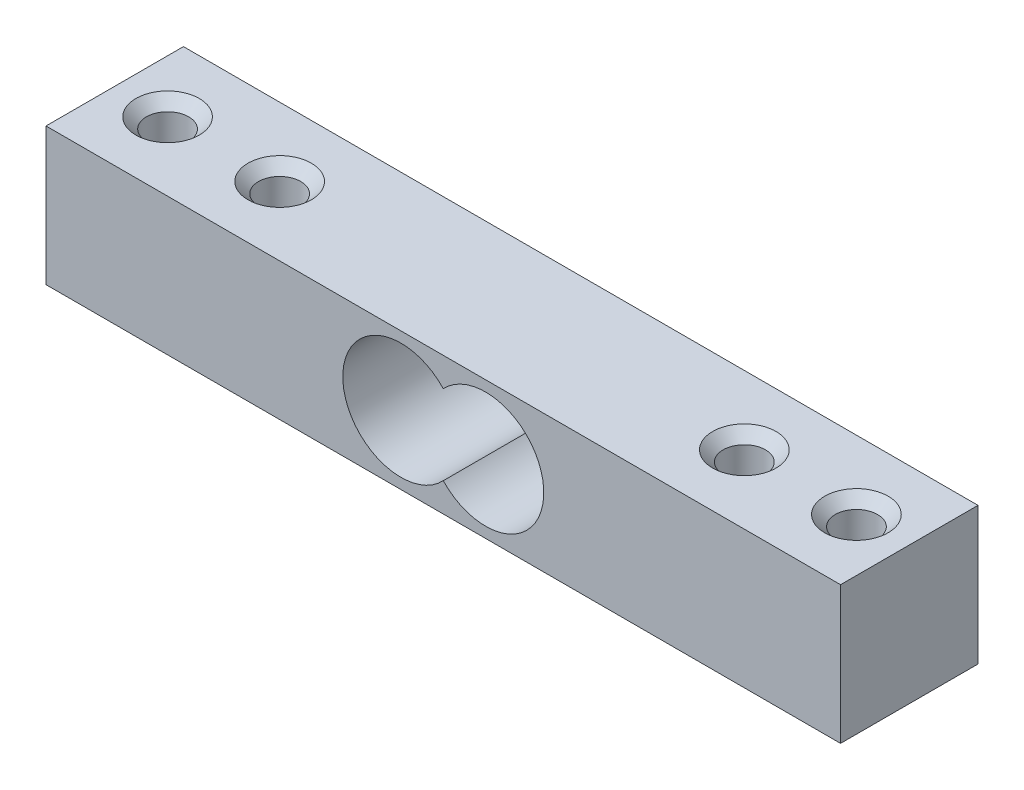
ISO-10303-21;
HEADER;
FILE_DESCRIPTION(('STEP AP214'),'2;1');
FILE_NAME('part.step','',(''),(''),'','','');
FILE_SCHEMA(('AUTOMOTIVE_DESIGN { 1 0 10303 214 1 1 1 1 }'));
ENDSEC;
DATA;
#1=APPLICATION_CONTEXT('core data for automotive mechanical design processes');
#2=APPLICATION_PROTOCOL_DEFINITION('international standard','automotive_design',2000,#1);
#3=PRODUCT_CONTEXT('',#1,'mechanical');
#4=PRODUCT('Part','Part','',(#3));
#5=PRODUCT_RELATED_PRODUCT_CATEGORY('part','',(#4));
#6=PRODUCT_DEFINITION_FORMATION('','',#4);
#7=PRODUCT_DEFINITION_CONTEXT('part definition',#1,'design');
#8=PRODUCT_DEFINITION('design','',#6,#7);
#9=PRODUCT_DEFINITION_SHAPE('','',#8);
#10=(LENGTH_UNIT() NAMED_UNIT(*) SI_UNIT(.MILLI.,.METRE.));
#11=(NAMED_UNIT(*) PLANE_ANGLE_UNIT() SI_UNIT($,.RADIAN.));
#12=(NAMED_UNIT(*) SI_UNIT($,.STERADIAN.) SOLID_ANGLE_UNIT());
#13=UNCERTAINTY_MEASURE_WITH_UNIT(LENGTH_MEASURE(1.E-05),#10,'distance_accuracy_value','');
#14=(GEOMETRIC_REPRESENTATION_CONTEXT(3) GLOBAL_UNCERTAINTY_ASSIGNED_CONTEXT((#13)) GLOBAL_UNIT_ASSIGNED_CONTEXT((#10,
#11,#12)) REPRESENTATION_CONTEXT('',''));
#15=CARTESIAN_POINT('',(0.,0.,0.));
#16=DIRECTION('',(0.,0.,1.));
#17=DIRECTION('',(1.,0.,0.));
#18=AXIS2_PLACEMENT_3D('',#15,#16,#17);
#19=CARTESIAN_POINT('',(0.,13.,0.));
#20=DIRECTION('',(0.,1.,0.));
#21=DIRECTION('',(0.,0.,1.));
#22=AXIS2_PLACEMENT_3D('',#19,#20,#21);
#23=PLANE('',#22);
#24=CARTESIAN_POINT('',(19.3793585526316,13.,-7.24161184210526));
#25=DIRECTION('',(0.,1.,0.));
#26=DIRECTION('',(0.,0.,1.));
#27=AXIS2_PLACEMENT_3D('',#24,#25,#26);
#28=CIRCLE('',#27,3.00000000000003);
#29=CARTESIAN_POINT('',(19.3793585526316,13.,-4.24161184210523));
#30=VERTEX_POINT('',#29);
#31=EDGE_CURVE('E162',#30,#30,#28,.F.);
#32=ORIENTED_EDGE('',*,*,#31,.T.);
#33=EDGE_LOOP('',(#32));
#34=FACE_BOUND('',#33,.T.);
#35=CARTESIAN_POINT('',(29.9793585526316,13.,-7.24161184210526));
#36=DIRECTION('',(0.,1.,0.));
#37=DIRECTION('',(0.,0.,1.));
#38=AXIS2_PLACEMENT_3D('',#35,#36,#37);
#39=CIRCLE('',#38,3.00000000000003);
#40=CARTESIAN_POINT('',(29.9793585526316,13.,-4.24161184210524));
#41=VERTEX_POINT('',#40);
#42=EDGE_CURVE('E159',#41,#41,#39,.F.);
#43=ORIENTED_EDGE('',*,*,#42,.T.);
#44=EDGE_LOOP('',(#43));
#45=FACE_BOUND('',#44,.T.);
#46=CARTESIAN_POINT('',(-24.5706414473684,13.,-7.24161184210527));
#47=DIRECTION('',(0.,1.,0.));
#48=DIRECTION('',(0.,0.,1.));
#49=AXIS2_PLACEMENT_3D('',#46,#47,#48);
#50=CIRCLE('',#49,3.00000000000003);
#51=CARTESIAN_POINT('',(-24.5706414473684,13.,-4.24161184210524));
#52=VERTEX_POINT('',#51);
#53=EDGE_CURVE('E156',#52,#52,#50,.F.);
#54=ORIENTED_EDGE('',*,*,#53,.T.);
#55=EDGE_LOOP('',(#54));
#56=FACE_BOUND('',#55,.T.);
#57=CARTESIAN_POINT('',(-35.1706414473684,13.,-7.24161184210526));
#58=DIRECTION('',(0.,1.,0.));
#59=DIRECTION('',(0.,0.,1.));
#60=AXIS2_PLACEMENT_3D('',#57,#58,#59);
#61=CIRCLE('',#60,3.00000000000003);
#62=CARTESIAN_POINT('',(-35.1706414473684,13.,-4.24161184210524));
#63=VERTEX_POINT('',#62);
#64=EDGE_CURVE('E153',#63,#63,#61,.F.);
#65=ORIENTED_EDGE('',*,*,#64,.T.);
#66=EDGE_LOOP('',(#65));
#67=FACE_BOUND('',#66,.T.);
#68=DIRECTION('',(0.,0.,1.));
#69=VECTOR('',#68,1.);
#70=CARTESIAN_POINT('',(-40.1706414473684,13.,-13.7416118421053));
#71=LINE('',#70,#69);
#72=CARTESIAN_POINT('',(-40.1706414473684,13.,-13.7416118421053));
#73=VERTEX_POINT('',#72);
#74=CARTESIAN_POINT('',(-40.1706414473684,13.,-0.741611842105264));
#75=VERTEX_POINT('',#74);
#76=EDGE_CURVE('E115',#73,#75,#71,.T.);
#77=ORIENTED_EDGE('',*,*,#76,.T.);
#78=DIRECTION('',(1.,0.,0.));
#79=VECTOR('',#78,1.);
#80=CARTESIAN_POINT('',(-40.1706414473684,13.,-0.741611842105264));
#81=LINE('',#80,#79);
#82=CARTESIAN_POINT('',(34.9793585526316,13.,-0.741611842105264));
#83=VERTEX_POINT('',#82);
#84=EDGE_CURVE('E118',#75,#83,#81,.T.);
#85=ORIENTED_EDGE('',*,*,#84,.T.);
#86=DIRECTION('',(0.,0.,-1.));
#87=VECTOR('',#86,1.);
#88=CARTESIAN_POINT('',(34.9793585526316,13.,-13.7416118421053));
#89=LINE('',#88,#87);
#90=CARTESIAN_POINT('',(34.9793585526316,13.,-13.7416118421053));
#91=VERTEX_POINT('',#90);
#92=EDGE_CURVE('E121',#83,#91,#89,.T.);
#93=ORIENTED_EDGE('',*,*,#92,.T.);
#94=DIRECTION('',(-1.,0.,0.));
#95=VECTOR('',#94,1.);
#96=CARTESIAN_POINT('',(-40.1706414473684,13.,-13.7416118421053));
#97=LINE('',#96,#95);
#98=EDGE_CURVE('E123',#91,#73,#97,.T.);
#99=ORIENTED_EDGE('',*,*,#98,.T.);
#100=EDGE_LOOP('',(#77,#85,#93,#99));
#101=FACE_BOUND('',#100,.T.);
#102=ADVANCED_FACE('F43',(#34,#45,#56,#67,#101),#23,.T.);
#103=CARTESIAN_POINT('',(0.,0.,0.));
#104=DIRECTION('',(0.,1.,0.));
#105=DIRECTION('',(0.,0.,1.));
#106=AXIS2_PLACEMENT_3D('',#103,#104,#105);
#107=PLANE('',#106);
#108=CARTESIAN_POINT('',(-24.5706414473684,0.,-7.24161184210527));
#109=DIRECTION('',(0.,1.,0.));
#110=DIRECTION('',(0.,0.,1.));
#111=AXIS2_PLACEMENT_3D('',#108,#109,#110);
#112=CIRCLE('',#111,2.99999999999997);
#113=CARTESIAN_POINT('',(-24.5706414473684,0.,-4.2416118421053));
#114=VERTEX_POINT('',#113);
#115=EDGE_CURVE('E12',#114,#114,#112,.T.);
#116=ORIENTED_EDGE('',*,*,#115,.T.);
#117=EDGE_LOOP('',(#116));
#118=FACE_BOUND('',#117,.T.);
#119=CARTESIAN_POINT('',(-35.1706414473684,0.,-7.24161184210526));
#120=DIRECTION('',(0.,1.,0.));
#121=DIRECTION('',(0.,0.,1.));
#122=AXIS2_PLACEMENT_3D('',#119,#120,#121);
#123=CIRCLE('',#122,2.99999999999997);
#124=CARTESIAN_POINT('',(-35.1706414473684,0.,-4.2416118421053));
#125=VERTEX_POINT('',#124);
#126=EDGE_CURVE('E52',#125,#125,#123,.T.);
#127=ORIENTED_EDGE('',*,*,#126,.T.);
#128=EDGE_LOOP('',(#127));
#129=FACE_BOUND('',#128,.T.);
#130=CARTESIAN_POINT('',(29.9793585526316,0.,-7.24161184210526));
#131=DIRECTION('',(0.,1.,0.));
#132=DIRECTION('',(0.,0.,1.));
#133=AXIS2_PLACEMENT_3D('',#130,#131,#132);
#134=CIRCLE('',#133,2.99999999999997);
#135=CARTESIAN_POINT('',(29.9793585526316,0.,-4.2416118421053));
#136=VERTEX_POINT('',#135);
#137=EDGE_CURVE('E183',#136,#136,#134,.T.);
#138=ORIENTED_EDGE('',*,*,#137,.T.);
#139=EDGE_LOOP('',(#138));
#140=FACE_BOUND('',#139,.T.);
#141=CARTESIAN_POINT('',(19.3793585526316,0.,-7.24161184210526));
#142=DIRECTION('',(0.,1.,0.));
#143=DIRECTION('',(0.,0.,1.));
#144=AXIS2_PLACEMENT_3D('',#141,#142,#143);
#145=CIRCLE('',#144,2.99999999999997);
#146=CARTESIAN_POINT('',(19.3793585526316,0.,-4.2416118421053));
#147=VERTEX_POINT('',#146);
#148=EDGE_CURVE('E144',#147,#147,#145,.T.);
#149=ORIENTED_EDGE('',*,*,#148,.T.);
#150=EDGE_LOOP('',(#149));
#151=FACE_BOUND('',#150,.T.);
#152=DIRECTION('',(0.,0.,1.));
#153=VECTOR('',#152,1.);
#154=CARTESIAN_POINT('',(-40.1706414473684,0.,-13.7416118421053));
#155=LINE('',#154,#153);
#156=CARTESIAN_POINT('',(-40.1706414473684,0.,-13.7416118421053));
#157=VERTEX_POINT('',#156);
#158=CARTESIAN_POINT('',(-40.1706414473684,0.,-0.741611842105264));
#159=VERTEX_POINT('',#158);
#160=EDGE_CURVE('E113',#157,#159,#155,.T.);
#161=ORIENTED_EDGE('',*,*,#160,.F.);
#162=DIRECTION('',(-1.,0.,0.));
#163=VECTOR('',#162,1.);
#164=CARTESIAN_POINT('',(-40.1706414473684,0.,-13.7416118421053));
#165=LINE('',#164,#163);
#166=CARTESIAN_POINT('',(34.9793585526316,0.,-13.7416118421053));
#167=VERTEX_POINT('',#166);
#168=EDGE_CURVE('E119',#167,#157,#165,.T.);
#169=ORIENTED_EDGE('',*,*,#168,.F.);
#170=DIRECTION('',(0.,0.,-1.));
#171=VECTOR('',#170,1.);
#172=CARTESIAN_POINT('',(34.9793585526316,0.,-13.7416118421053));
#173=LINE('',#172,#171);
#174=CARTESIAN_POINT('',(34.9793585526316,0.,-0.741611842105264));
#175=VERTEX_POINT('',#174);
#176=EDGE_CURVE('E130',#175,#167,#173,.T.);
#177=ORIENTED_EDGE('',*,*,#176,.F.);
#178=DIRECTION('',(1.,0.,0.));
#179=VECTOR('',#178,1.);
#180=CARTESIAN_POINT('',(-40.1706414473684,0.,-0.741611842105264));
#181=LINE('',#180,#179);
#182=EDGE_CURVE('E128',#159,#175,#181,.T.);
#183=ORIENTED_EDGE('',*,*,#182,.F.);
#184=EDGE_LOOP('',(#161,#169,#177,#183));
#185=FACE_BOUND('',#184,.T.);
#186=ADVANCED_FACE('F188',(#118,#129,#140,#151,#185),#107,.F.);
#187=CARTESIAN_POINT('',(-40.1706414473684,13.,-13.7416118421053));
#188=DIRECTION('',(1.,0.,0.));
#189=DIRECTION('',(0.,0.,-1.));
#190=AXIS2_PLACEMENT_3D('',#187,#188,#189);
#191=PLANE('',#190);
#192=ORIENTED_EDGE('',*,*,#160,.T.);
#193=DIRECTION('',(0.,-1.,0.));
#194=VECTOR('',#193,1.);
#195=CARTESIAN_POINT('',(-40.1706414473684,13.,-0.741611842105264));
#196=LINE('',#195,#194);
#197=EDGE_CURVE('E141',#75,#159,#196,.T.);
#198=ORIENTED_EDGE('',*,*,#197,.F.);
#199=ORIENTED_EDGE('',*,*,#76,.F.);
#200=DIRECTION('',(0.,-1.,0.));
#201=VECTOR('',#200,1.);
#202=CARTESIAN_POINT('',(-40.1706414473684,13.,-13.7416118421053));
#203=LINE('',#202,#201);
#204=EDGE_CURVE('E125',#73,#157,#203,.T.);
#205=ORIENTED_EDGE('',*,*,#204,.T.);
#206=EDGE_LOOP('',(#192,#198,#199,#205));
#207=FACE_BOUND('',#206,.T.);
#208=ADVANCED_FACE('F211',(#207),#191,.F.);
#209=CARTESIAN_POINT('',(-40.1706414473684,13.,-0.741611842105264));
#210=DIRECTION('',(0.,0.,-1.));
#211=DIRECTION('',(-1.,0.,0.));
#212=AXIS2_PLACEMENT_3D('',#209,#210,#211);
#213=PLANE('',#212);
#214=CARTESIAN_POINT('',(1.40935855263157,6.5,-0.741611842105264));
#215=DIRECTION('',(0.,0.,1.));
#216=DIRECTION('',(1.,0.,0.));
#217=AXIS2_PLACEMENT_3D('',#214,#215,#216);
#218=CIRCLE('',#217,5.5);
#219=CARTESIAN_POINT('',(-2.59564144736842,2.73038795099548,-0.741611842105264));
#220=VERTEX_POINT('',#219);
#221=CARTESIAN_POINT('',(-2.59564144736842,10.2696120490045,-0.741611842105264));
#222=VERTEX_POINT('',#221);
#223=EDGE_CURVE('E108',#220,#222,#218,.T.);
#224=ORIENTED_EDGE('',*,*,#223,.F.);
#225=CARTESIAN_POINT('',(-6.60064144736842,6.5,-0.741611842105264));
#226=DIRECTION('',(0.,0.,1.));
#227=DIRECTION('',(1.,0.,0.));
#228=AXIS2_PLACEMENT_3D('',#225,#226,#227);
#229=CIRCLE('',#228,5.5);
#230=EDGE_CURVE('E59',#222,#220,#229,.T.);
#231=ORIENTED_EDGE('',*,*,#230,.F.);
#232=EDGE_LOOP('',(#224,#231));
#233=FACE_BOUND('',#232,.T.);
#234=ORIENTED_EDGE('',*,*,#182,.T.);
#235=DIRECTION('',(0.,-1.,0.));
#236=VECTOR('',#235,1.);
#237=CARTESIAN_POINT('',(34.9793585526316,13.,-0.741611842105264));
#238=LINE('',#237,#236);
#239=EDGE_CURVE('E138',#83,#175,#238,.T.);
#240=ORIENTED_EDGE('',*,*,#239,.F.);
#241=ORIENTED_EDGE('',*,*,#84,.F.);
#242=ORIENTED_EDGE('',*,*,#197,.T.);
#243=EDGE_LOOP('',(#234,#240,#241,#242));
#244=FACE_BOUND('',#243,.T.);
#245=ADVANCED_FACE('F224',(#233,#244),#213,.F.);
#246=CARTESIAN_POINT('',(34.9793585526316,13.,-13.7416118421053));
#247=DIRECTION('',(-1.,0.,0.));
#248=DIRECTION('',(0.,0.,1.));
#249=AXIS2_PLACEMENT_3D('',#246,#247,#248);
#250=PLANE('',#249);
#251=ORIENTED_EDGE('',*,*,#176,.T.);
#252=DIRECTION('',(0.,-1.,0.));
#253=VECTOR('',#252,1.);
#254=CARTESIAN_POINT('',(34.9793585526316,13.,-13.7416118421053));
#255=LINE('',#254,#253);
#256=EDGE_CURVE('E135',#91,#167,#255,.T.);
#257=ORIENTED_EDGE('',*,*,#256,.F.);
#258=ORIENTED_EDGE('',*,*,#92,.F.);
#259=ORIENTED_EDGE('',*,*,#239,.T.);
#260=EDGE_LOOP('',(#251,#257,#258,#259));
#261=FACE_BOUND('',#260,.T.);
#262=ADVANCED_FACE('F221',(#261),#250,.F.);
#263=CARTESIAN_POINT('',(-40.1706414473684,13.,-13.7416118421053));
#264=DIRECTION('',(0.,0.,1.));
#265=DIRECTION('',(1.,0.,0.));
#266=AXIS2_PLACEMENT_3D('',#263,#264,#265);
#267=PLANE('',#266);
#268=CARTESIAN_POINT('',(1.40935855263157,6.5,-13.7416118421053));
#269=DIRECTION('',(0.,0.,1.));
#270=DIRECTION('',(1.,0.,0.));
#271=AXIS2_PLACEMENT_3D('',#268,#269,#270);
#272=CIRCLE('',#271,5.5);
#273=CARTESIAN_POINT('',(-2.59564144736842,2.73038795099548,-13.7416118421053));
#274=VERTEX_POINT('',#273);
#275=CARTESIAN_POINT('',(-2.59564144736842,10.2696120490045,-13.7416118421053));
#276=VERTEX_POINT('',#275);
#277=EDGE_CURVE('E100',#274,#276,#272,.T.);
#278=ORIENTED_EDGE('',*,*,#277,.T.);
#279=CARTESIAN_POINT('',(-6.60064144736842,6.5,-13.7416118421053));
#280=DIRECTION('',(0.,0.,1.));
#281=DIRECTION('',(1.,0.,0.));
#282=AXIS2_PLACEMENT_3D('',#279,#280,#281);
#283=CIRCLE('',#282,5.5);
#284=EDGE_CURVE('E64',#276,#274,#283,.T.);
#285=ORIENTED_EDGE('',*,*,#284,.T.);
#286=EDGE_LOOP('',(#278,#285));
#287=FACE_BOUND('',#286,.T.);
#288=ORIENTED_EDGE('',*,*,#168,.T.);
#289=ORIENTED_EDGE('',*,*,#204,.F.);
#290=ORIENTED_EDGE('',*,*,#98,.F.);
#291=ORIENTED_EDGE('',*,*,#256,.T.);
#292=EDGE_LOOP('',(#288,#289,#290,#291));
#293=FACE_BOUND('',#292,.T.);
#294=ADVANCED_FACE('F106',(#287,#293),#267,.F.);
#295=CARTESIAN_POINT('',(29.9793585526316,13.,-7.24161184210526));
#296=DIRECTION('',(0.,-1.,0.));
#297=DIRECTION('',(0.,0.,-1.));
#298=AXIS2_PLACEMENT_3D('',#295,#296,#297);
#299=CYLINDRICAL_SURFACE('',#298,2.);
#300=CARTESIAN_POINT('',(29.9793585526316,12.,-7.24161184210526));
#301=DIRECTION('',(0.,1.,0.));
#302=DIRECTION('',(0.,0.,1.));
#303=AXIS2_PLACEMENT_3D('',#300,#301,#302);
#304=CIRCLE('',#303,2.);
#305=CARTESIAN_POINT('',(29.9793585526316,12.,-9.24161184210527));
#306=VERTEX_POINT('',#305);
#307=EDGE_CURVE('E168',#306,#306,#304,.T.);
#308=CARTESIAN_POINT('',(29.9793585526316,0.999999999999971,-7.24161184210526));
#309=DIRECTION('',(0.,1.,0.));
#310=DIRECTION('',(0.,0.,1.));
#311=AXIS2_PLACEMENT_3D('',#308,#309,#310);
#312=CIRCLE('',#311,2.);
#313=CARTESIAN_POINT('',(29.9793585526316,0.99999999999997,-9.24161184210527));
#314=VERTEX_POINT('',#313);
#315=EDGE_CURVE('E165',#314,#314,#312,.F.);
#316=CARTESIAN_POINT('',(29.9793585526316,12.,-9.24161184210527));
#317=CARTESIAN_POINT('',(29.9793585526316,11.8854166666666,-9.24161184210527));
#318=CARTESIAN_POINT('',(29.9793585526316,11.7708333333333,-9.24161184210527));
#319=CARTESIAN_POINT('',(29.9793585526316,11.5416666666666,-9.24161184210527));
#320=CARTESIAN_POINT('',(29.9793585526316,11.4270833333333,-9.24161184210527));
#321=CARTESIAN_POINT('',(29.9793585526316,11.1979166666666,-9.24161184210527));
#322=CARTESIAN_POINT('',(29.9793585526316,11.0833333333333,-9.24161184210527));
#323=CARTESIAN_POINT('',(29.9793585526316,10.8541666666666,-9.24161184210527));
#324=CARTESIAN_POINT('',(29.9793585526316,10.7395833333333,-9.24161184210527));
#325=CARTESIAN_POINT('',(29.9793585526316,10.5104166666666,-9.24161184210527));
#326=CARTESIAN_POINT('',(29.9793585526316,10.3958333333333,-9.24161184210527));
#327=CARTESIAN_POINT('',(29.9793585526316,10.1666666666666,-9.24161184210527));
#328=CARTESIAN_POINT('',(29.9793585526316,10.0520833333333,-9.24161184210527));
#329=CARTESIAN_POINT('',(29.9793585526316,9.82291666666664,-9.24161184210527));
#330=CARTESIAN_POINT('',(29.9793585526316,9.7083333333333,-9.24161184210527));
#331=CARTESIAN_POINT('',(29.9793585526316,9.47916666666664,-9.24161184210527));
#332=CARTESIAN_POINT('',(29.9793585526316,9.3645833333333,-9.24161184210527));
#333=CARTESIAN_POINT('',(29.9793585526316,9.13541666666664,-9.24161184210527));
#334=CARTESIAN_POINT('',(29.9793585526316,9.0208333333333,-9.24161184210527));
#335=CARTESIAN_POINT('',(29.9793585526316,8.79166666666664,-9.24161184210527));
#336=CARTESIAN_POINT('',(29.9793585526316,8.6770833333333,-9.24161184210527));
#337=CARTESIAN_POINT('',(29.9793585526316,8.44791666666664,-9.24161184210527));
#338=CARTESIAN_POINT('',(29.9793585526316,8.33333333333331,-9.24161184210527));
#339=CARTESIAN_POINT('',(29.9793585526316,8.10416666666664,-9.24161184210527));
#340=CARTESIAN_POINT('',(29.9793585526316,7.98958333333331,-9.24161184210527));
#341=CARTESIAN_POINT('',(29.9793585526316,7.76041666666664,-9.24161184210527));
#342=CARTESIAN_POINT('',(29.9793585526316,7.6458333333333,-9.24161184210527));
#343=CARTESIAN_POINT('',(29.9793585526316,7.41666666666664,-9.24161184210527));
#344=CARTESIAN_POINT('',(29.9793585526316,7.3020833333333,-9.24161184210527));
#345=CARTESIAN_POINT('',(29.9793585526316,7.07291666666664,-9.24161184210527));
#346=CARTESIAN_POINT('',(29.9793585526316,6.9583333333333,-9.24161184210527));
#347=CARTESIAN_POINT('',(29.9793585526316,6.72916666666664,-9.24161184210527));
#348=CARTESIAN_POINT('',(29.9793585526316,6.6145833333333,-9.24161184210527));
#349=CARTESIAN_POINT('',(29.9793585526316,6.38541666666664,-9.24161184210527));
#350=CARTESIAN_POINT('',(29.9793585526316,6.2708333333333,-9.24161184210527));
#351=CARTESIAN_POINT('',(29.9793585526316,6.04166666666664,-9.24161184210527));
#352=CARTESIAN_POINT('',(29.9793585526316,5.9270833333333,-9.24161184210527));
#353=CARTESIAN_POINT('',(29.9793585526316,5.69791666666664,-9.24161184210527));
#354=CARTESIAN_POINT('',(29.9793585526316,5.5833333333333,-9.24161184210527));
#355=CARTESIAN_POINT('',(29.9793585526316,5.35416666666664,-9.24161184210527));
#356=CARTESIAN_POINT('',(29.9793585526316,5.2395833333333,-9.24161184210527));
#357=CARTESIAN_POINT('',(29.9793585526316,5.01041666666664,-9.24161184210527));
#358=CARTESIAN_POINT('',(29.9793585526316,4.8958333333333,-9.24161184210527));
#359=CARTESIAN_POINT('',(29.9793585526316,4.66666666666664,-9.24161184210527));
#360=CARTESIAN_POINT('',(29.9793585526316,4.5520833333333,-9.24161184210527));
#361=CARTESIAN_POINT('',(29.9793585526316,4.32291666666664,-9.24161184210527));
#362=CARTESIAN_POINT('',(29.9793585526316,4.2083333333333,-9.24161184210527));
#363=CARTESIAN_POINT('',(29.9793585526316,3.97916666666664,-9.24161184210527));
#364=CARTESIAN_POINT('',(29.9793585526316,3.8645833333333,-9.24161184210527));
#365=CARTESIAN_POINT('',(29.9793585526316,3.63541666666664,-9.24161184210527));
#366=CARTESIAN_POINT('',(29.9793585526316,3.5208333333333,-9.24161184210527));
#367=CARTESIAN_POINT('',(29.9793585526316,3.29166666666664,-9.24161184210527));
#368=CARTESIAN_POINT('',(29.9793585526316,3.1770833333333,-9.24161184210527));
#369=CARTESIAN_POINT('',(29.9793585526316,2.94791666666664,-9.24161184210527));
#370=CARTESIAN_POINT('',(29.9793585526316,2.8333333333333,-9.24161184210527));
#371=CARTESIAN_POINT('',(29.9793585526316,2.60416666666664,-9.24161184210527));
#372=CARTESIAN_POINT('',(29.9793585526316,2.4895833333333,-9.24161184210527));
#373=CARTESIAN_POINT('',(29.9793585526316,2.26041666666664,-9.24161184210527));
#374=CARTESIAN_POINT('',(29.9793585526316,2.1458333333333,-9.24161184210527));
#375=CARTESIAN_POINT('',(29.9793585526316,1.91666666666664,-9.24161184210527));
#376=CARTESIAN_POINT('',(29.9793585526316,1.8020833333333,-9.24161184210527));
#377=CARTESIAN_POINT('',(29.9793585526316,1.57291666666664,-9.24161184210527));
#378=CARTESIAN_POINT('',(29.9793585526316,1.4583333333333,-9.24161184210527));
#379=CARTESIAN_POINT('',(29.9793585526316,1.22916666666664,-9.24161184210527));
#380=CARTESIAN_POINT('',(29.9793585526316,1.1145833333333,-9.24161184210527));
#381=CARTESIAN_POINT('',(29.9793585526316,0.99999999999997,-9.24161184210527));
#382=B_SPLINE_CURVE_WITH_KNOTS('',3,(#316,#317,#318,#319,#320,#321,#322,#323,#324,#325,#326,
#327,#328,#329,#330,#331,#332,#333,#334,#335,#336,#337,#338,#339,#340,#341,#342,#343,#344,#345,
#346,#347,#348,#349,#350,#351,#352,#353,#354,#355,#356,#357,#358,#359,#360,#361,#362,#363,#364,
#365,#366,#367,#368,#369,#370,#371,#372,#373,#374,#375,#376,#377,#378,#379,#380,#381),
.UNSPECIFIED.,.F.,.F.,(4,2,2,2,2,2,2,2,2,2,2,2,2,2,2,2,2,2,2,2,2,2,2,2,2,2,2,2,2,2,2,2,4),(0.,
0.343749999999999,0.687499999999999,1.03125,1.375,1.71875,2.0625,2.40625,2.75,3.09375,3.4375,
3.78125,4.125,4.46875,4.8125,5.15625,5.5,5.84375,6.1875,6.53125,6.875,7.21875,7.5625,7.90625,
8.25,8.59375,8.9375,9.28125,9.625,9.96875,10.3125,10.65625,11.),.UNSPECIFIED.);
#383=EDGE_CURVE('BSEAM216',#306,#314,#382,.T.);
#384=ORIENTED_EDGE('',*,*,#307,.T.);
#385=ORIENTED_EDGE('',*,*,#315,.T.);
#386=ORIENTED_EDGE('',*,*,#383,.T.);
#387=ORIENTED_EDGE('',*,*,#383,.F.);
#388=EDGE_LOOP('',(#384,#386,#385,#387));
#389=FACE_BOUND('',#388,.T.);
#390=ADVANCED_FACE('F216',(#389),#299,.F.);
#391=CARTESIAN_POINT('',(19.3793585526316,13.,-7.24161184210526));
#392=DIRECTION('',(0.,-1.,0.));
#393=DIRECTION('',(0.,0.,-1.));
#394=AXIS2_PLACEMENT_3D('',#391,#392,#393);
#395=CYLINDRICAL_SURFACE('',#394,2.);
#396=CARTESIAN_POINT('',(19.3793585526316,12.,-7.24161184210526));
#397=DIRECTION('',(0.,1.,0.));
#398=DIRECTION('',(0.,0.,1.));
#399=AXIS2_PLACEMENT_3D('',#396,#397,#398);
#400=CIRCLE('',#399,2.);
#401=CARTESIAN_POINT('',(19.3793585526316,12.,-9.24161184210526));
#402=VERTEX_POINT('',#401);
#403=EDGE_CURVE('E150',#402,#402,#400,.T.);
#404=CARTESIAN_POINT('',(19.3793585526316,0.999999999999975,-7.24161184210526));
#405=DIRECTION('',(0.,1.,0.));
#406=DIRECTION('',(0.,0.,1.));
#407=AXIS2_PLACEMENT_3D('',#404,#405,#406);
#408=CIRCLE('',#407,2.);
#409=CARTESIAN_POINT('',(19.3793585526316,0.999999999999973,-9.24161184210526));
#410=VERTEX_POINT('',#409);
#411=EDGE_CURVE('E147',#410,#410,#408,.F.);
#412=CARTESIAN_POINT('',(19.3793585526316,12.,-9.24161184210526));
#413=CARTESIAN_POINT('',(19.3793585526316,11.8854166666666,-9.24161184210526));
#414=CARTESIAN_POINT('',(19.3793585526316,11.7708333333333,-9.24161184210526));
#415=CARTESIAN_POINT('',(19.3793585526316,11.5416666666666,-9.24161184210526));
#416=CARTESIAN_POINT('',(19.3793585526316,11.4270833333333,-9.24161184210526));
#417=CARTESIAN_POINT('',(19.3793585526316,11.1979166666666,-9.24161184210526));
#418=CARTESIAN_POINT('',(19.3793585526316,11.0833333333333,-9.24161184210526));
#419=CARTESIAN_POINT('',(19.3793585526316,10.8541666666666,-9.24161184210526));
#420=CARTESIAN_POINT('',(19.3793585526316,10.7395833333333,-9.24161184210526));
#421=CARTESIAN_POINT('',(19.3793585526316,10.5104166666666,-9.24161184210526));
#422=CARTESIAN_POINT('',(19.3793585526316,10.3958333333333,-9.24161184210526));
#423=CARTESIAN_POINT('',(19.3793585526316,10.1666666666666,-9.24161184210526));
#424=CARTESIAN_POINT('',(19.3793585526316,10.0520833333333,-9.24161184210526));
#425=CARTESIAN_POINT('',(19.3793585526316,9.82291666666664,-9.24161184210526));
#426=CARTESIAN_POINT('',(19.3793585526316,9.7083333333333,-9.24161184210526));
#427=CARTESIAN_POINT('',(19.3793585526316,9.47916666666664,-9.24161184210526));
#428=CARTESIAN_POINT('',(19.3793585526316,9.3645833333333,-9.24161184210526));
#429=CARTESIAN_POINT('',(19.3793585526316,9.13541666666664,-9.24161184210526));
#430=CARTESIAN_POINT('',(19.3793585526316,9.0208333333333,-9.24161184210526));
#431=CARTESIAN_POINT('',(19.3793585526316,8.79166666666664,-9.24161184210526));
#432=CARTESIAN_POINT('',(19.3793585526316,8.6770833333333,-9.24161184210526));
#433=CARTESIAN_POINT('',(19.3793585526316,8.44791666666664,-9.24161184210526));
#434=CARTESIAN_POINT('',(19.3793585526316,8.3333333333333,-9.24161184210526));
#435=CARTESIAN_POINT('',(19.3793585526316,8.10416666666664,-9.24161184210526));
#436=CARTESIAN_POINT('',(19.3793585526316,7.9895833333333,-9.24161184210526));
#437=CARTESIAN_POINT('',(19.3793585526316,7.76041666666664,-9.24161184210526));
#438=CARTESIAN_POINT('',(19.3793585526316,7.6458333333333,-9.24161184210526));
#439=CARTESIAN_POINT('',(19.3793585526316,7.41666666666664,-9.24161184210526));
#440=CARTESIAN_POINT('',(19.3793585526316,7.3020833333333,-9.24161184210526));
#441=CARTESIAN_POINT('',(19.3793585526316,7.07291666666664,-9.24161184210526));
#442=CARTESIAN_POINT('',(19.3793585526316,6.9583333333333,-9.24161184210526));
#443=CARTESIAN_POINT('',(19.3793585526316,6.72916666666664,-9.24161184210526));
#444=CARTESIAN_POINT('',(19.3793585526316,6.6145833333333,-9.24161184210526));
#445=CARTESIAN_POINT('',(19.3793585526316,6.38541666666664,-9.24161184210526));
#446=CARTESIAN_POINT('',(19.3793585526316,6.2708333333333,-9.24161184210526));
#447=CARTESIAN_POINT('',(19.3793585526316,6.04166666666664,-9.24161184210526));
#448=CARTESIAN_POINT('',(19.3793585526316,5.9270833333333,-9.24161184210526));
#449=CARTESIAN_POINT('',(19.3793585526316,5.69791666666664,-9.24161184210526));
#450=CARTESIAN_POINT('',(19.3793585526316,5.5833333333333,-9.24161184210526));
#451=CARTESIAN_POINT('',(19.3793585526316,5.35416666666664,-9.24161184210526));
#452=CARTESIAN_POINT('',(19.3793585526316,5.2395833333333,-9.24161184210526));
#453=CARTESIAN_POINT('',(19.3793585526316,5.01041666666664,-9.24161184210526));
#454=CARTESIAN_POINT('',(19.3793585526316,4.8958333333333,-9.24161184210526));
#455=CARTESIAN_POINT('',(19.3793585526316,4.66666666666664,-9.24161184210526));
#456=CARTESIAN_POINT('',(19.3793585526316,4.55208333333331,-9.24161184210526));
#457=CARTESIAN_POINT('',(19.3793585526316,4.32291666666664,-9.24161184210526));
#458=CARTESIAN_POINT('',(19.3793585526316,4.20833333333331,-9.24161184210526));
#459=CARTESIAN_POINT('',(19.3793585526316,3.97916666666664,-9.24161184210526));
#460=CARTESIAN_POINT('',(19.3793585526316,3.86458333333331,-9.24161184210526));
#461=CARTESIAN_POINT('',(19.3793585526316,3.63541666666664,-9.24161184210526));
#462=CARTESIAN_POINT('',(19.3793585526316,3.52083333333331,-9.24161184210526));
#463=CARTESIAN_POINT('',(19.3793585526316,3.29166666666664,-9.24161184210526));
#464=CARTESIAN_POINT('',(19.3793585526316,3.1770833333333,-9.24161184210526));
#465=CARTESIAN_POINT('',(19.3793585526316,2.94791666666664,-9.24161184210526));
#466=CARTESIAN_POINT('',(19.3793585526316,2.83333333333331,-9.24161184210526));
#467=CARTESIAN_POINT('',(19.3793585526316,2.60416666666664,-9.24161184210526));
#468=CARTESIAN_POINT('',(19.3793585526316,2.48958333333331,-9.24161184210526));
#469=CARTESIAN_POINT('',(19.3793585526316,2.26041666666664,-9.24161184210526));
#470=CARTESIAN_POINT('',(19.3793585526316,2.14583333333331,-9.24161184210526));
#471=CARTESIAN_POINT('',(19.3793585526316,1.91666666666664,-9.24161184210526));
#472=CARTESIAN_POINT('',(19.3793585526316,1.80208333333331,-9.24161184210526));
#473=CARTESIAN_POINT('',(19.3793585526316,1.57291666666664,-9.24161184210526));
#474=CARTESIAN_POINT('',(19.3793585526316,1.45833333333331,-9.24161184210526));
#475=CARTESIAN_POINT('',(19.3793585526316,1.22916666666664,-9.24161184210526));
#476=CARTESIAN_POINT('',(19.3793585526316,1.11458333333331,-9.24161184210526));
#477=CARTESIAN_POINT('',(19.3793585526316,0.999999999999973,-9.24161184210526));
#478=B_SPLINE_CURVE_WITH_KNOTS('',3,(#412,#413,#414,#415,#416,#417,#418,#419,#420,#421,#422,
#423,#424,#425,#426,#427,#428,#429,#430,#431,#432,#433,#434,#435,#436,#437,#438,#439,#440,#441,
#442,#443,#444,#445,#446,#447,#448,#449,#450,#451,#452,#453,#454,#455,#456,#457,#458,#459,#460,
#461,#462,#463,#464,#465,#466,#467,#468,#469,#470,#471,#472,#473,#474,#475,#476,#477),
.UNSPECIFIED.,.F.,.F.,(4,2,2,2,2,2,2,2,2,2,2,2,2,2,2,2,2,2,2,2,2,2,2,2,2,2,2,2,2,2,2,2,4),(0.,
0.343749999999999,0.687499999999999,1.03125,1.375,1.71875,2.0625,2.40625,2.75,3.09375,3.4375,
3.78125,4.125,4.46875,4.8125,5.15625,5.5,5.84375,6.1875,6.53125,6.875,7.21875,7.56249999999999,
7.90624999999999,8.24999999999999,8.59374999999999,8.9375,9.28124999999999,9.62499999999999,
9.96874999999999,10.3125,10.65625,11.),.UNSPECIFIED.);
#479=EDGE_CURVE('BSEAM282',#402,#410,#478,.T.);
#480=ORIENTED_EDGE('',*,*,#403,.T.);
#481=ORIENTED_EDGE('',*,*,#411,.T.);
#482=ORIENTED_EDGE('',*,*,#479,.T.);
#483=ORIENTED_EDGE('',*,*,#479,.F.);
#484=EDGE_LOOP('',(#480,#482,#481,#483));
#485=FACE_BOUND('',#484,.T.);
#486=ADVANCED_FACE('F282',(#485),#395,.F.);
#487=CARTESIAN_POINT('',(-35.1706414473684,13.,-7.24161184210526));
#488=DIRECTION('',(0.,-1.,0.));
#489=DIRECTION('',(0.,0.,-1.));
#490=AXIS2_PLACEMENT_3D('',#487,#488,#489);
#491=CYLINDRICAL_SURFACE('',#490,2.);
#492=CARTESIAN_POINT('',(-35.1706414473684,12.,-7.24161184210526));
#493=DIRECTION('',(0.,1.,0.));
#494=DIRECTION('',(0.,0.,1.));
#495=AXIS2_PLACEMENT_3D('',#492,#493,#494);
#496=CIRCLE('',#495,2.);
#497=CARTESIAN_POINT('',(-35.1706414473684,12.,-9.24161184210527));
#498=VERTEX_POINT('',#497);
#499=EDGE_CURVE('E180',#498,#498,#496,.T.);
#500=CARTESIAN_POINT('',(-35.1706414473684,0.999999999999971,-7.24161184210526));
#501=DIRECTION('',(0.,1.,0.));
#502=DIRECTION('',(0.,0.,1.));
#503=AXIS2_PLACEMENT_3D('',#500,#501,#502);
#504=CIRCLE('',#503,2.);
#505=CARTESIAN_POINT('',(-35.1706414473684,0.99999999999997,-9.24161184210527));
#506=VERTEX_POINT('',#505);
#507=EDGE_CURVE('E177',#506,#506,#504,.F.);
#508=CARTESIAN_POINT('',(-35.1706414473684,12.,-9.24161184210527));
#509=CARTESIAN_POINT('',(-35.1706414473684,11.8854166666666,-9.24161184210527));
#510=CARTESIAN_POINT('',(-35.1706414473684,11.7708333333333,-9.24161184210527));
#511=CARTESIAN_POINT('',(-35.1706414473684,11.5416666666666,-9.24161184210527));
#512=CARTESIAN_POINT('',(-35.1706414473684,11.4270833333333,-9.24161184210527));
#513=CARTESIAN_POINT('',(-35.1706414473684,11.1979166666666,-9.24161184210527));
#514=CARTESIAN_POINT('',(-35.1706414473684,11.0833333333333,-9.24161184210527));
#515=CARTESIAN_POINT('',(-35.1706414473684,10.8541666666666,-9.24161184210527));
#516=CARTESIAN_POINT('',(-35.1706414473684,10.7395833333333,-9.24161184210527));
#517=CARTESIAN_POINT('',(-35.1706414473684,10.5104166666666,-9.24161184210527));
#518=CARTESIAN_POINT('',(-35.1706414473684,10.3958333333333,-9.24161184210527));
#519=CARTESIAN_POINT('',(-35.1706414473684,10.1666666666666,-9.24161184210527));
#520=CARTESIAN_POINT('',(-35.1706414473684,10.0520833333333,-9.24161184210527));
#521=CARTESIAN_POINT('',(-35.1706414473684,9.82291666666664,-9.24161184210527));
#522=CARTESIAN_POINT('',(-35.1706414473684,9.7083333333333,-9.24161184210527));
#523=CARTESIAN_POINT('',(-35.1706414473684,9.47916666666664,-9.24161184210527));
#524=CARTESIAN_POINT('',(-35.1706414473684,9.3645833333333,-9.24161184210527));
#525=CARTESIAN_POINT('',(-35.1706414473684,9.13541666666664,-9.24161184210527));
#526=CARTESIAN_POINT('',(-35.1706414473684,9.0208333333333,-9.24161184210527));
#527=CARTESIAN_POINT('',(-35.1706414473684,8.79166666666664,-9.24161184210527));
#528=CARTESIAN_POINT('',(-35.1706414473684,8.6770833333333,-9.24161184210527));
#529=CARTESIAN_POINT('',(-35.1706414473684,8.44791666666664,-9.24161184210527));
#530=CARTESIAN_POINT('',(-35.1706414473684,8.33333333333331,-9.24161184210527));
#531=CARTESIAN_POINT('',(-35.1706414473684,8.10416666666664,-9.24161184210527));
#532=CARTESIAN_POINT('',(-35.1706414473684,7.98958333333331,-9.24161184210527));
#533=CARTESIAN_POINT('',(-35.1706414473684,7.76041666666664,-9.24161184210527));
#534=CARTESIAN_POINT('',(-35.1706414473684,7.6458333333333,-9.24161184210527));
#535=CARTESIAN_POINT('',(-35.1706414473684,7.41666666666664,-9.24161184210527));
#536=CARTESIAN_POINT('',(-35.1706414473684,7.3020833333333,-9.24161184210527));
#537=CARTESIAN_POINT('',(-35.1706414473684,7.07291666666664,-9.24161184210527));
#538=CARTESIAN_POINT('',(-35.1706414473684,6.9583333333333,-9.24161184210527));
#539=CARTESIAN_POINT('',(-35.1706414473684,6.72916666666664,-9.24161184210527));
#540=CARTESIAN_POINT('',(-35.1706414473684,6.6145833333333,-9.24161184210527));
#541=CARTESIAN_POINT('',(-35.1706414473684,6.38541666666664,-9.24161184210527));
#542=CARTESIAN_POINT('',(-35.1706414473684,6.2708333333333,-9.24161184210527));
#543=CARTESIAN_POINT('',(-35.1706414473684,6.04166666666664,-9.24161184210527));
#544=CARTESIAN_POINT('',(-35.1706414473684,5.9270833333333,-9.24161184210527));
#545=CARTESIAN_POINT('',(-35.1706414473684,5.69791666666664,-9.24161184210527));
#546=CARTESIAN_POINT('',(-35.1706414473684,5.5833333333333,-9.24161184210527));
#547=CARTESIAN_POINT('',(-35.1706414473684,5.35416666666664,-9.24161184210527));
#548=CARTESIAN_POINT('',(-35.1706414473684,5.2395833333333,-9.24161184210527));
#549=CARTESIAN_POINT('',(-35.1706414473684,5.01041666666664,-9.24161184210527));
#550=CARTESIAN_POINT('',(-35.1706414473684,4.8958333333333,-9.24161184210527));
#551=CARTESIAN_POINT('',(-35.1706414473684,4.66666666666664,-9.24161184210527));
#552=CARTESIAN_POINT('',(-35.1706414473684,4.5520833333333,-9.24161184210527));
#553=CARTESIAN_POINT('',(-35.1706414473684,4.32291666666664,-9.24161184210527));
#554=CARTESIAN_POINT('',(-35.1706414473684,4.2083333333333,-9.24161184210527));
#555=CARTESIAN_POINT('',(-35.1706414473684,3.97916666666664,-9.24161184210527));
#556=CARTESIAN_POINT('',(-35.1706414473684,3.8645833333333,-9.24161184210527));
#557=CARTESIAN_POINT('',(-35.1706414473684,3.63541666666664,-9.24161184210527));
#558=CARTESIAN_POINT('',(-35.1706414473684,3.5208333333333,-9.24161184210527));
#559=CARTESIAN_POINT('',(-35.1706414473684,3.29166666666664,-9.24161184210527));
#560=CARTESIAN_POINT('',(-35.1706414473684,3.1770833333333,-9.24161184210527));
#561=CARTESIAN_POINT('',(-35.1706414473684,2.94791666666664,-9.24161184210527));
#562=CARTESIAN_POINT('',(-35.1706414473684,2.8333333333333,-9.24161184210527));
#563=CARTESIAN_POINT('',(-35.1706414473684,2.60416666666664,-9.24161184210527));
#564=CARTESIAN_POINT('',(-35.1706414473684,2.4895833333333,-9.24161184210527));
#565=CARTESIAN_POINT('',(-35.1706414473684,2.26041666666664,-9.24161184210527));
#566=CARTESIAN_POINT('',(-35.1706414473684,2.1458333333333,-9.24161184210527));
#567=CARTESIAN_POINT('',(-35.1706414473684,1.91666666666664,-9.24161184210527));
#568=CARTESIAN_POINT('',(-35.1706414473684,1.8020833333333,-9.24161184210527));
#569=CARTESIAN_POINT('',(-35.1706414473684,1.57291666666664,-9.24161184210527));
#570=CARTESIAN_POINT('',(-35.1706414473684,1.4583333333333,-9.24161184210527));
#571=CARTESIAN_POINT('',(-35.1706414473684,1.22916666666664,-9.24161184210527));
#572=CARTESIAN_POINT('',(-35.1706414473684,1.1145833333333,-9.24161184210527));
#573=CARTESIAN_POINT('',(-35.1706414473684,0.99999999999997,-9.24161184210527));
#574=B_SPLINE_CURVE_WITH_KNOTS('',3,(#508,#509,#510,#511,#512,#513,#514,#515,#516,#517,#518,
#519,#520,#521,#522,#523,#524,#525,#526,#527,#528,#529,#530,#531,#532,#533,#534,#535,#536,#537,
#538,#539,#540,#541,#542,#543,#544,#545,#546,#547,#548,#549,#550,#551,#552,#553,#554,#555,#556,
#557,#558,#559,#560,#561,#562,#563,#564,#565,#566,#567,#568,#569,#570,#571,#572,#573),
.UNSPECIFIED.,.F.,.F.,(4,2,2,2,2,2,2,2,2,2,2,2,2,2,2,2,2,2,2,2,2,2,2,2,2,2,2,2,2,2,2,2,4),(0.,
0.343749999999999,0.687499999999999,1.03125,1.375,1.71875,2.0625,2.40625,2.75,3.09375,3.4375,
3.78125,4.125,4.46875,4.8125,5.15625,5.5,5.84375,6.1875,6.53125,6.875,7.21875,7.5625,7.90625,
8.25,8.59375,8.9375,9.28125,9.625,9.96875,10.3125,10.65625,11.),.UNSPECIFIED.);
#575=EDGE_CURVE('BSEAM279',#498,#506,#574,.T.);
#576=ORIENTED_EDGE('',*,*,#499,.T.);
#577=ORIENTED_EDGE('',*,*,#507,.T.);
#578=ORIENTED_EDGE('',*,*,#575,.T.);
#579=ORIENTED_EDGE('',*,*,#575,.F.);
#580=EDGE_LOOP('',(#576,#578,#577,#579));
#581=FACE_BOUND('',#580,.T.);
#582=ADVANCED_FACE('F279',(#581),#491,.F.);
#583=CARTESIAN_POINT('',(-24.5706414473684,13.,-7.24161184210527));
#584=DIRECTION('',(0.,-1.,0.));
#585=DIRECTION('',(0.,0.,-1.));
#586=AXIS2_PLACEMENT_3D('',#583,#584,#585);
#587=CYLINDRICAL_SURFACE('',#586,2.);
#588=CARTESIAN_POINT('',(-24.5706414473684,12.,-7.24161184210527));
#589=DIRECTION('',(0.,1.,0.));
#590=DIRECTION('',(0.,0.,1.));
#591=AXIS2_PLACEMENT_3D('',#588,#589,#590);
#592=CIRCLE('',#591,2.);
#593=CARTESIAN_POINT('',(-24.5706414473684,12.,-9.24161184210526));
#594=VERTEX_POINT('',#593);
#595=EDGE_CURVE('E174',#594,#594,#592,.T.);
#596=CARTESIAN_POINT('',(-24.5706414473684,0.999999999999975,-7.24161184210527));
#597=DIRECTION('',(0.,1.,0.));
#598=DIRECTION('',(0.,0.,1.));
#599=AXIS2_PLACEMENT_3D('',#596,#597,#598);
#600=CIRCLE('',#599,2.);
#601=CARTESIAN_POINT('',(-24.5706414473684,0.999999999999973,-9.24161184210526));
#602=VERTEX_POINT('',#601);
#603=EDGE_CURVE('E171',#602,#602,#600,.F.);
#604=CARTESIAN_POINT('',(-24.5706414473684,12.,-9.24161184210526));
#605=CARTESIAN_POINT('',(-24.5706414473684,11.8854166666666,-9.24161184210526));
#606=CARTESIAN_POINT('',(-24.5706414473684,11.7708333333333,-9.24161184210526));
#607=CARTESIAN_POINT('',(-24.5706414473684,11.5416666666666,-9.24161184210526));
#608=CARTESIAN_POINT('',(-24.5706414473684,11.4270833333333,-9.24161184210526));
#609=CARTESIAN_POINT('',(-24.5706414473684,11.1979166666666,-9.24161184210526));
#610=CARTESIAN_POINT('',(-24.5706414473684,11.0833333333333,-9.24161184210526));
#611=CARTESIAN_POINT('',(-24.5706414473684,10.8541666666666,-9.24161184210526));
#612=CARTESIAN_POINT('',(-24.5706414473684,10.7395833333333,-9.24161184210526));
#613=CARTESIAN_POINT('',(-24.5706414473684,10.5104166666666,-9.24161184210526));
#614=CARTESIAN_POINT('',(-24.5706414473684,10.3958333333333,-9.24161184210526));
#615=CARTESIAN_POINT('',(-24.5706414473684,10.1666666666666,-9.24161184210526));
#616=CARTESIAN_POINT('',(-24.5706414473684,10.0520833333333,-9.24161184210526));
#617=CARTESIAN_POINT('',(-24.5706414473684,9.82291666666664,-9.24161184210526));
#618=CARTESIAN_POINT('',(-24.5706414473684,9.7083333333333,-9.24161184210526));
#619=CARTESIAN_POINT('',(-24.5706414473684,9.47916666666664,-9.24161184210526));
#620=CARTESIAN_POINT('',(-24.5706414473684,9.3645833333333,-9.24161184210526));
#621=CARTESIAN_POINT('',(-24.5706414473684,9.13541666666664,-9.24161184210526));
#622=CARTESIAN_POINT('',(-24.5706414473684,9.0208333333333,-9.24161184210526));
#623=CARTESIAN_POINT('',(-24.5706414473684,8.79166666666664,-9.24161184210526));
#624=CARTESIAN_POINT('',(-24.5706414473684,8.6770833333333,-9.24161184210526));
#625=CARTESIAN_POINT('',(-24.5706414473684,8.44791666666664,-9.24161184210526));
#626=CARTESIAN_POINT('',(-24.5706414473684,8.3333333333333,-9.24161184210526));
#627=CARTESIAN_POINT('',(-24.5706414473684,8.10416666666664,-9.24161184210526));
#628=CARTESIAN_POINT('',(-24.5706414473684,7.9895833333333,-9.24161184210526));
#629=CARTESIAN_POINT('',(-24.5706414473684,7.76041666666664,-9.24161184210526));
#630=CARTESIAN_POINT('',(-24.5706414473684,7.6458333333333,-9.24161184210526));
#631=CARTESIAN_POINT('',(-24.5706414473684,7.41666666666664,-9.24161184210526));
#632=CARTESIAN_POINT('',(-24.5706414473684,7.3020833333333,-9.24161184210526));
#633=CARTESIAN_POINT('',(-24.5706414473684,7.07291666666664,-9.24161184210526));
#634=CARTESIAN_POINT('',(-24.5706414473684,6.9583333333333,-9.24161184210526));
#635=CARTESIAN_POINT('',(-24.5706414473684,6.72916666666664,-9.24161184210526));
#636=CARTESIAN_POINT('',(-24.5706414473684,6.6145833333333,-9.24161184210526));
#637=CARTESIAN_POINT('',(-24.5706414473684,6.38541666666664,-9.24161184210526));
#638=CARTESIAN_POINT('',(-24.5706414473684,6.2708333333333,-9.24161184210526));
#639=CARTESIAN_POINT('',(-24.5706414473684,6.04166666666664,-9.24161184210526));
#640=CARTESIAN_POINT('',(-24.5706414473684,5.9270833333333,-9.24161184210526));
#641=CARTESIAN_POINT('',(-24.5706414473684,5.69791666666664,-9.24161184210526));
#642=CARTESIAN_POINT('',(-24.5706414473684,5.5833333333333,-9.24161184210526));
#643=CARTESIAN_POINT('',(-24.5706414473684,5.35416666666664,-9.24161184210526));
#644=CARTESIAN_POINT('',(-24.5706414473684,5.2395833333333,-9.24161184210526));
#645=CARTESIAN_POINT('',(-24.5706414473684,5.01041666666664,-9.24161184210526));
#646=CARTESIAN_POINT('',(-24.5706414473684,4.8958333333333,-9.24161184210526));
#647=CARTESIAN_POINT('',(-24.5706414473684,4.66666666666664,-9.24161184210526));
#648=CARTESIAN_POINT('',(-24.5706414473684,4.55208333333331,-9.24161184210526));
#649=CARTESIAN_POINT('',(-24.5706414473684,4.32291666666664,-9.24161184210526));
#650=CARTESIAN_POINT('',(-24.5706414473684,4.20833333333331,-9.24161184210526));
#651=CARTESIAN_POINT('',(-24.5706414473684,3.97916666666664,-9.24161184210526));
#652=CARTESIAN_POINT('',(-24.5706414473684,3.86458333333331,-9.24161184210526));
#653=CARTESIAN_POINT('',(-24.5706414473684,3.63541666666664,-9.24161184210526));
#654=CARTESIAN_POINT('',(-24.5706414473684,3.52083333333331,-9.24161184210526));
#655=CARTESIAN_POINT('',(-24.5706414473684,3.29166666666664,-9.24161184210526));
#656=CARTESIAN_POINT('',(-24.5706414473684,3.1770833333333,-9.24161184210526));
#657=CARTESIAN_POINT('',(-24.5706414473684,2.94791666666664,-9.24161184210526));
#658=CARTESIAN_POINT('',(-24.5706414473684,2.83333333333331,-9.24161184210526));
#659=CARTESIAN_POINT('',(-24.5706414473684,2.60416666666664,-9.24161184210526));
#660=CARTESIAN_POINT('',(-24.5706414473684,2.48958333333331,-9.24161184210526));
#661=CARTESIAN_POINT('',(-24.5706414473684,2.26041666666664,-9.24161184210526));
#662=CARTESIAN_POINT('',(-24.5706414473684,2.14583333333331,-9.24161184210526));
#663=CARTESIAN_POINT('',(-24.5706414473684,1.91666666666664,-9.24161184210526));
#664=CARTESIAN_POINT('',(-24.5706414473684,1.80208333333331,-9.24161184210526));
#665=CARTESIAN_POINT('',(-24.5706414473684,1.57291666666664,-9.24161184210526));
#666=CARTESIAN_POINT('',(-24.5706414473684,1.45833333333331,-9.24161184210526));
#667=CARTESIAN_POINT('',(-24.5706414473684,1.22916666666664,-9.24161184210526));
#668=CARTESIAN_POINT('',(-24.5706414473684,1.11458333333331,-9.24161184210526));
#669=CARTESIAN_POINT('',(-24.5706414473684,0.999999999999973,-9.24161184210526));
#670=B_SPLINE_CURVE_WITH_KNOTS('',3,(#604,#605,#606,#607,#608,#609,#610,#611,#612,#613,#614,
#615,#616,#617,#618,#619,#620,#621,#622,#623,#624,#625,#626,#627,#628,#629,#630,#631,#632,#633,
#634,#635,#636,#637,#638,#639,#640,#641,#642,#643,#644,#645,#646,#647,#648,#649,#650,#651,#652,
#653,#654,#655,#656,#657,#658,#659,#660,#661,#662,#663,#664,#665,#666,#667,#668,#669),
.UNSPECIFIED.,.F.,.F.,(4,2,2,2,2,2,2,2,2,2,2,2,2,2,2,2,2,2,2,2,2,2,2,2,2,2,2,2,2,2,2,2,4),(0.,
0.343749999999999,0.687499999999999,1.03125,1.375,1.71875,2.0625,2.40625,2.75,3.09375,3.4375,
3.78125,4.125,4.46875,4.8125,5.15625,5.5,5.84375,6.1875,6.53125,6.875,7.21875,7.56249999999999,
7.90624999999999,8.24999999999999,8.59374999999999,8.9375,9.28124999999999,9.62499999999999,
9.96874999999999,10.3125,10.65625,11.),.UNSPECIFIED.);
#671=EDGE_CURVE('BSEAM240',#594,#602,#670,.T.);
#672=ORIENTED_EDGE('',*,*,#595,.T.);
#673=ORIENTED_EDGE('',*,*,#603,.T.);
#674=ORIENTED_EDGE('',*,*,#671,.T.);
#675=ORIENTED_EDGE('',*,*,#671,.F.);
#676=EDGE_LOOP('',(#672,#674,#673,#675));
#677=FACE_BOUND('',#676,.T.);
#678=ADVANCED_FACE('F240',(#677),#587,.F.);
#679=CARTESIAN_POINT('',(19.3793585526316,0.,-7.24161184210526));
#680=DIRECTION('',(0.,-1.,0.));
#681=DIRECTION('',(0.,0.,-1.));
#682=AXIS2_PLACEMENT_3D('',#679,#680,#681);
#683=CONICAL_SURFACE('',#682,2.99999999999997,0.785398163397445);
#684=ORIENTED_EDGE('',*,*,#411,.F.);
#685=EDGE_LOOP('',(#684));
#686=FACE_BOUND('',#685,.T.);
#687=ORIENTED_EDGE('',*,*,#148,.F.);
#688=EDGE_LOOP('',(#687));
#689=FACE_BOUND('',#688,.T.);
#690=ADVANCED_FACE('F233',(#686,#689),#683,.F.);
#691=CARTESIAN_POINT('',(19.3793585526316,12.,-7.24161184210526));
#692=DIRECTION('',(0.,1.,0.));
#693=DIRECTION('',(0.,0.,1.));
#694=AXIS2_PLACEMENT_3D('',#691,#692,#693);
#695=CONICAL_SURFACE('',#694,2.,0.785398163397449);
#696=ORIENTED_EDGE('',*,*,#31,.F.);
#697=EDGE_LOOP('',(#696));
#698=FACE_BOUND('',#697,.T.);
#699=ORIENTED_EDGE('',*,*,#403,.F.);
#700=EDGE_LOOP('',(#699));
#701=FACE_BOUND('',#700,.T.);
#702=ADVANCED_FACE('F239',(#698,#701),#695,.F.);
#703=CARTESIAN_POINT('',(29.9793585526316,12.,-7.24161184210526));
#704=DIRECTION('',(0.,1.,0.));
#705=DIRECTION('',(0.,0.,1.));
#706=AXIS2_PLACEMENT_3D('',#703,#704,#705);
#707=CONICAL_SURFACE('',#706,2.,0.785398163397448);
#708=ORIENTED_EDGE('',*,*,#42,.F.);
#709=EDGE_LOOP('',(#708));
#710=FACE_BOUND('',#709,.T.);
#711=ORIENTED_EDGE('',*,*,#307,.F.);
#712=EDGE_LOOP('',(#711));
#713=FACE_BOUND('',#712,.T.);
#714=ADVANCED_FACE('F247',(#710,#713),#707,.F.);
#715=CARTESIAN_POINT('',(-24.5706414473684,12.,-7.24161184210527));
#716=DIRECTION('',(0.,1.,0.));
#717=DIRECTION('',(0.,0.,1.));
#718=AXIS2_PLACEMENT_3D('',#715,#716,#717);
#719=CONICAL_SURFACE('',#718,2.,0.785398163397448);
#720=ORIENTED_EDGE('',*,*,#53,.F.);
#721=EDGE_LOOP('',(#720));
#722=FACE_BOUND('',#721,.T.);
#723=ORIENTED_EDGE('',*,*,#595,.F.);
#724=EDGE_LOOP('',(#723));
#725=FACE_BOUND('',#724,.T.);
#726=ADVANCED_FACE('F254',(#722,#725),#719,.F.);
#727=CARTESIAN_POINT('',(-35.1706414473684,12.,-7.24161184210526));
#728=DIRECTION('',(0.,1.,0.));
#729=DIRECTION('',(0.,0.,1.));
#730=AXIS2_PLACEMENT_3D('',#727,#728,#729);
#731=CONICAL_SURFACE('',#730,2.,0.785398163397448);
#732=ORIENTED_EDGE('',*,*,#64,.F.);
#733=EDGE_LOOP('',(#732));
#734=FACE_BOUND('',#733,.T.);
#735=ORIENTED_EDGE('',*,*,#499,.F.);
#736=EDGE_LOOP('',(#735));
#737=FACE_BOUND('',#736,.T.);
#738=ADVANCED_FACE('F200',(#734,#737),#731,.F.);
#739=CARTESIAN_POINT('',(-24.5706414473684,0.,-7.24161184210527));
#740=DIRECTION('',(0.,-1.,0.));
#741=DIRECTION('',(0.,0.,-1.));
#742=AXIS2_PLACEMENT_3D('',#739,#740,#741);
#743=CONICAL_SURFACE('',#742,2.99999999999997,0.785398163397445);
#744=ORIENTED_EDGE('',*,*,#603,.F.);
#745=EDGE_LOOP('',(#744));
#746=FACE_BOUND('',#745,.T.);
#747=ORIENTED_EDGE('',*,*,#115,.F.);
#748=EDGE_LOOP('',(#747));
#749=FACE_BOUND('',#748,.T.);
#750=ADVANCED_FACE('F193',(#746,#749),#743,.F.);
#751=CARTESIAN_POINT('',(-35.1706414473684,0.,-7.24161184210526));
#752=DIRECTION('',(0.,-1.,0.));
#753=DIRECTION('',(0.,0.,-1.));
#754=AXIS2_PLACEMENT_3D('',#751,#752,#753);
#755=CONICAL_SURFACE('',#754,2.99999999999997,0.785398163397445);
#756=ORIENTED_EDGE('',*,*,#507,.F.);
#757=EDGE_LOOP('',(#756));
#758=FACE_BOUND('',#757,.T.);
#759=ORIENTED_EDGE('',*,*,#126,.F.);
#760=EDGE_LOOP('',(#759));
#761=FACE_BOUND('',#760,.T.);
#762=ADVANCED_FACE('F191',(#758,#761),#755,.F.);
#763=CARTESIAN_POINT('',(29.9793585526316,0.,-7.24161184210526));
#764=DIRECTION('',(0.,-1.,0.));
#765=DIRECTION('',(0.,0.,-1.));
#766=AXIS2_PLACEMENT_3D('',#763,#764,#765);
#767=CONICAL_SURFACE('',#766,2.99999999999997,0.785398163397445);
#768=ORIENTED_EDGE('',*,*,#315,.F.);
#769=EDGE_LOOP('',(#768));
#770=FACE_BOUND('',#769,.T.);
#771=ORIENTED_EDGE('',*,*,#137,.F.);
#772=EDGE_LOOP('',(#771));
#773=FACE_BOUND('',#772,.T.);
#774=ADVANCED_FACE('F46',(#770,#773),#767,.F.);
#775=CARTESIAN_POINT('',(-6.60064144736842,6.5,-13.7416118421053));
#776=DIRECTION('',(0.,0.,1.));
#777=DIRECTION('',(1.,0.,0.));
#778=AXIS2_PLACEMENT_3D('',#775,#776,#777);
#779=CYLINDRICAL_SURFACE('',#778,5.5);
#780=ORIENTED_EDGE('',*,*,#230,.T.);
#781=DIRECTION('',(0.,0.,1.));
#782=VECTOR('',#781,1.);
#783=CARTESIAN_POINT('',(-2.59564144736842,2.73038795099548,-13.7416118421053));
#784=LINE('',#783,#782);
#785=EDGE_CURVE('E93',#274,#220,#784,.T.);
#786=ORIENTED_EDGE('',*,*,#785,.F.);
#787=ORIENTED_EDGE('',*,*,#284,.F.);
#788=DIRECTION('',(0.,0.,1.));
#789=VECTOR('',#788,1.);
#790=CARTESIAN_POINT('',(-2.59564144736842,10.2696120490045,-13.7416118421053));
#791=LINE('',#790,#789);
#792=EDGE_CURVE('E99',#276,#222,#791,.T.);
#793=ORIENTED_EDGE('',*,*,#792,.T.);
#794=EDGE_LOOP('',(#780,#786,#787,#793));
#795=FACE_BOUND('',#794,.T.);
#796=ADVANCED_FACE('F95',(#795),#779,.F.);
#797=CARTESIAN_POINT('',(1.40935855263157,6.5,-13.7416118421053));
#798=DIRECTION('',(0.,0.,1.));
#799=DIRECTION('',(1.,0.,0.));
#800=AXIS2_PLACEMENT_3D('',#797,#798,#799);
#801=CYLINDRICAL_SURFACE('',#800,5.5);
#802=ORIENTED_EDGE('',*,*,#223,.T.);
#803=ORIENTED_EDGE('',*,*,#792,.F.);
#804=ORIENTED_EDGE('',*,*,#277,.F.);
#805=ORIENTED_EDGE('',*,*,#785,.T.);
#806=EDGE_LOOP('',(#802,#803,#804,#805));
#807=FACE_BOUND('',#806,.T.);
#808=ADVANCED_FACE('F103',(#807),#801,.F.);
#809=CLOSED_SHELL('',(#102,#186,#208,#245,#262,#294,#390,#486,#582,#678,#690,#702,#714,#726,
#738,#750,#762,#774,#796,#808));
#810=MANIFOLD_SOLID_BREP('B2',#809);
#811=ADVANCED_BREP_SHAPE_REPRESENTATION('',(#18,#810),#14);
#812=SHAPE_DEFINITION_REPRESENTATION(#9,#811);
ENDSEC;
END-ISO-10303-21;
